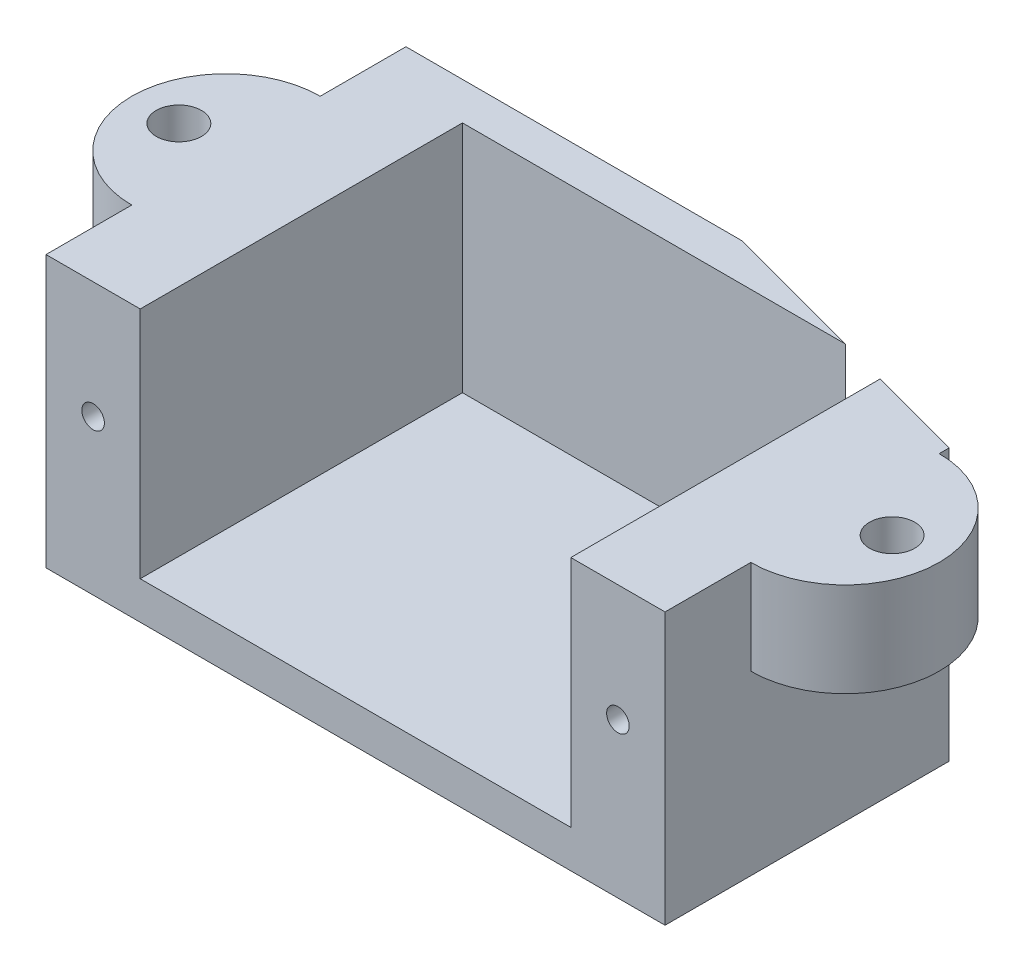
ISO-10303-21;
HEADER;
FILE_DESCRIPTION(('STEP AP214'),'2;1');
FILE_NAME('part.step','',(''),(''),'','','');
FILE_SCHEMA(('AUTOMOTIVE_DESIGN { 1 0 10303 214 1 1 1 1 }'));
ENDSEC;
DATA;
#1=APPLICATION_CONTEXT('core data for automotive mechanical design processes');
#2=APPLICATION_PROTOCOL_DEFINITION('international standard','automotive_design',2000,#1);
#3=PRODUCT_CONTEXT('',#1,'mechanical');
#4=PRODUCT('Part','Part','',(#3));
#5=PRODUCT_RELATED_PRODUCT_CATEGORY('part','',(#4));
#6=PRODUCT_DEFINITION_FORMATION('','',#4);
#7=PRODUCT_DEFINITION_CONTEXT('part definition',#1,'design');
#8=PRODUCT_DEFINITION('design','',#6,#7);
#9=PRODUCT_DEFINITION_SHAPE('','',#8);
#10=(LENGTH_UNIT() NAMED_UNIT(*) SI_UNIT(.MILLI.,.METRE.));
#11=(NAMED_UNIT(*) PLANE_ANGLE_UNIT() SI_UNIT($,.RADIAN.));
#12=(NAMED_UNIT(*) SI_UNIT($,.STERADIAN.) SOLID_ANGLE_UNIT());
#13=UNCERTAINTY_MEASURE_WITH_UNIT(LENGTH_MEASURE(1.E-05),#10,'distance_accuracy_value','');
#14=(GEOMETRIC_REPRESENTATION_CONTEXT(3) GLOBAL_UNCERTAINTY_ASSIGNED_CONTEXT((#13)) GLOBAL_UNIT_ASSIGNED_CONTEXT((#10,
#11,#12)) REPRESENTATION_CONTEXT('',''));
#15=CARTESIAN_POINT('',(0.,0.,0.));
#16=DIRECTION('',(0.,0.,1.));
#17=DIRECTION('',(1.,0.,0.));
#18=AXIS2_PLACEMENT_3D('',#15,#16,#17);
#19=CARTESIAN_POINT('',(16.425,8.2,17.1));
#20=DIRECTION('',(-1.,0.,0.));
#21=DIRECTION('',(0.,0.,1.));
#22=AXIS2_PLACEMENT_3D('',#19,#20,#21);
#23=PLANE('',#22);
#24=DIRECTION('',(0.,1.,0.));
#25=VECTOR('',#24,1.);
#26=CARTESIAN_POINT('',(16.425,1.2,12.55));
#27=LINE('',#26,#25);
#28=CARTESIAN_POINT('',(16.425,1.2,12.55));
#29=VERTEX_POINT('',#28);
#30=CARTESIAN_POINT('',(16.425,6.2,12.55));
#31=VERTEX_POINT('',#30);
#32=EDGE_CURVE('E155',#29,#31,#27,.T.);
#33=ORIENTED_EDGE('',*,*,#32,.T.);
#34=DIRECTION('',(0.,0.,1.));
#35=VECTOR('',#34,1.);
#36=CARTESIAN_POINT('',(16.425,6.2,-2.001));
#37=LINE('',#36,#35);
#38=CARTESIAN_POINT('',(16.425,6.2,17.1));
#39=VERTEX_POINT('',#38);
#40=EDGE_CURVE('E143',#31,#39,#37,.T.);
#41=ORIENTED_EDGE('',*,*,#40,.T.);
#42=DIRECTION('',(0.,1.,0.));
#43=VECTOR('',#42,1.);
#44=CARTESIAN_POINT('',(16.425,8.2,17.1));
#45=LINE('',#44,#43);
#46=CARTESIAN_POINT('',(16.425,-8.2,17.1));
#47=VERTEX_POINT('',#46);
#48=EDGE_CURVE('E260',#47,#39,#45,.T.);
#49=ORIENTED_EDGE('',*,*,#48,.F.);
#50=DIRECTION('',(0.,0.,-1.));
#51=VECTOR('',#50,1.);
#52=CARTESIAN_POINT('',(16.425,-8.2,17.1));
#53=LINE('',#52,#51);
#54=CARTESIAN_POINT('',(16.425,-8.2,2.01923788646674));
#55=VERTEX_POINT('',#54);
#56=EDGE_CURVE('E262',#47,#55,#53,.T.);
#57=ORIENTED_EDGE('',*,*,#56,.T.);
#58=DIRECTION('',(0.,-1.,0.));
#59=VECTOR('',#58,1.);
#60=CARTESIAN_POINT('',(16.425,8.2,2.01923788646674));
#61=LINE('',#60,#59);
#62=CARTESIAN_POINT('',(16.425,6.2,2.01923788646674));
#63=VERTEX_POINT('',#62);
#64=EDGE_CURVE('E201',#63,#55,#61,.T.);
#65=ORIENTED_EDGE('',*,*,#64,.F.);
#66=CARTESIAN_POINT('',(16.425,6.2,2.55));
#67=VERTEX_POINT('',#66);
#68=EDGE_CURVE('E151',#63,#67,#37,.T.);
#69=ORIENTED_EDGE('',*,*,#68,.T.);
#70=DIRECTION('',(0.,1.,0.));
#71=VECTOR('',#70,1.);
#72=CARTESIAN_POINT('',(16.425,1.2,2.55));
#73=LINE('',#72,#71);
#74=CARTESIAN_POINT('',(16.425,1.2,2.55));
#75=VERTEX_POINT('',#74);
#76=EDGE_CURVE('E52',#75,#67,#73,.T.);
#77=ORIENTED_EDGE('',*,*,#76,.F.);
#78=DIRECTION('',(0.,0.,-1.));
#79=VECTOR('',#78,1.);
#80=CARTESIAN_POINT('',(16.425,1.2,2.55));
#81=LINE('',#80,#79);
#82=EDGE_CURVE('E56',#29,#75,#81,.T.);
#83=ORIENTED_EDGE('',*,*,#82,.F.);
#84=EDGE_LOOP('',(#33,#41,#49,#57,#65,#69,#77,#83));
#85=FACE_BOUND('',#84,.T.);
#86=ADVANCED_FACE('F37',(#85),#23,.F.);
#87=CARTESIAN_POINT('',(0.,0.,17.1));
#88=DIRECTION('',(0.,0.,-1.));
#89=DIRECTION('',(-1.,0.,0.));
#90=AXIS2_PLACEMENT_3D('',#87,#88,#89);
#91=PLANE('',#90);
#92=CARTESIAN_POINT('',(13.925,0.,17.1));
#93=DIRECTION('',(0.,0.,1.));
#94=DIRECTION('',(1.,0.,0.));
#95=AXIS2_PLACEMENT_3D('',#92,#93,#94);
#96=CIRCLE('',#95,0.599999999999998);
#97=CARTESIAN_POINT('',(14.525,0.,17.1));
#98=VERTEX_POINT('',#97);
#99=EDGE_CURVE('E212',#98,#98,#96,.T.);
#100=ORIENTED_EDGE('',*,*,#99,.F.);
#101=EDGE_LOOP('',(#100));
#102=FACE_BOUND('',#101,.T.);
#103=CARTESIAN_POINT('',(-13.925,0.,17.1));
#104=DIRECTION('',(0.,0.,1.));
#105=DIRECTION('',(1.,0.,0.));
#106=AXIS2_PLACEMENT_3D('',#103,#104,#105);
#107=CIRCLE('',#106,0.599999999999998);
#108=CARTESIAN_POINT('',(-13.325,0.,17.1));
#109=VERTEX_POINT('',#108);
#110=EDGE_CURVE('E218',#109,#109,#107,.T.);
#111=ORIENTED_EDGE('',*,*,#110,.F.);
#112=EDGE_LOOP('',(#111));
#113=FACE_BOUND('',#112,.T.);
#114=ORIENTED_EDGE('',*,*,#48,.T.);
#115=DIRECTION('',(1.,0.,0.));
#116=VECTOR('',#115,1.);
#117=CARTESIAN_POINT('',(-16.425,6.2,17.1));
#118=LINE('',#117,#116);
#119=CARTESIAN_POINT('',(11.425,6.2,17.1));
#120=VERTEX_POINT('',#119);
#121=EDGE_CURVE('E148',#120,#39,#118,.T.);
#122=ORIENTED_EDGE('',*,*,#121,.F.);
#123=DIRECTION('',(0.,1.,0.));
#124=VECTOR('',#123,1.);
#125=CARTESIAN_POINT('',(11.425,6.2,17.1));
#126=LINE('',#125,#124);
#127=CARTESIAN_POINT('',(11.425,-6.2,17.1));
#128=VERTEX_POINT('',#127);
#129=EDGE_CURVE('E235',#128,#120,#126,.T.);
#130=ORIENTED_EDGE('',*,*,#129,.F.);
#131=DIRECTION('',(1.,0.,0.));
#132=VECTOR('',#131,1.);
#133=CARTESIAN_POINT('',(11.425,-6.2,17.1));
#134=LINE('',#133,#132);
#135=CARTESIAN_POINT('',(-11.425,-6.2,17.1));
#136=VERTEX_POINT('',#135);
#137=EDGE_CURVE('E232',#136,#128,#134,.T.);
#138=ORIENTED_EDGE('',*,*,#137,.F.);
#139=DIRECTION('',(0.,-1.,0.));
#140=VECTOR('',#139,1.);
#141=CARTESIAN_POINT('',(-11.425,6.2,17.1));
#142=LINE('',#141,#140);
#143=CARTESIAN_POINT('',(-11.425,6.2,17.1));
#144=VERTEX_POINT('',#143);
#145=EDGE_CURVE('E230',#144,#136,#142,.T.);
#146=ORIENTED_EDGE('',*,*,#145,.F.);
#147=CARTESIAN_POINT('',(-16.425,6.2,17.1));
#148=VERTEX_POINT('',#147);
#149=EDGE_CURVE('E189',#148,#144,#118,.T.);
#150=ORIENTED_EDGE('',*,*,#149,.F.);
#151=DIRECTION('',(0.,-1.,0.));
#152=VECTOR('',#151,1.);
#153=CARTESIAN_POINT('',(-16.425,8.2,17.1));
#154=LINE('',#153,#152);
#155=CARTESIAN_POINT('',(-16.425,-8.2,17.1));
#156=VERTEX_POINT('',#155);
#157=EDGE_CURVE('E256',#148,#156,#154,.T.);
#158=ORIENTED_EDGE('',*,*,#157,.T.);
#159=DIRECTION('',(1.,0.,0.));
#160=VECTOR('',#159,1.);
#161=CARTESIAN_POINT('',(16.425,-8.2,17.1));
#162=LINE('',#161,#160);
#163=EDGE_CURVE('E258',#156,#47,#162,.T.);
#164=ORIENTED_EDGE('',*,*,#163,.T.);
#165=EDGE_LOOP('',(#114,#122,#130,#138,#146,#150,#158,#164));
#166=FACE_BOUND('',#165,.T.);
#167=ADVANCED_FACE('F285',(#102,#113,#166),#91,.F.);
#168=CARTESIAN_POINT('',(-16.425,8.2,17.1));
#169=DIRECTION('',(1.,0.,0.));
#170=DIRECTION('',(0.,0.,-1.));
#171=AXIS2_PLACEMENT_3D('',#168,#169,#170);
#172=PLANE('',#171);
#173=DIRECTION('',(0.,0.,-1.));
#174=VECTOR('',#173,1.);
#175=CARTESIAN_POINT('',(-16.425,1.2,2.55));
#176=LINE('',#175,#174);
#177=CARTESIAN_POINT('',(-16.425,1.2,12.55));
#178=VERTEX_POINT('',#177);
#179=CARTESIAN_POINT('',(-16.425,1.2,2.55));
#180=VERTEX_POINT('',#179);
#181=EDGE_CURVE('E179',#178,#180,#176,.T.);
#182=ORIENTED_EDGE('',*,*,#181,.T.);
#183=DIRECTION('',(0.,1.,0.));
#184=VECTOR('',#183,1.);
#185=CARTESIAN_POINT('',(-16.425,1.2,2.55));
#186=LINE('',#185,#184);
#187=CARTESIAN_POINT('',(-16.425,6.2,2.55));
#188=VERTEX_POINT('',#187);
#189=EDGE_CURVE('E184',#180,#188,#186,.T.);
#190=ORIENTED_EDGE('',*,*,#189,.T.);
#191=DIRECTION('',(0.,0.,1.));
#192=VECTOR('',#191,1.);
#193=CARTESIAN_POINT('',(-16.425,6.2,-2.001));
#194=LINE('',#193,#192);
#195=CARTESIAN_POINT('',(-16.425,6.2,-2.));
#196=VERTEX_POINT('',#195);
#197=EDGE_CURVE('E152',#196,#188,#194,.T.);
#198=ORIENTED_EDGE('',*,*,#197,.F.);
#199=DIRECTION('',(0.,1.,0.));
#200=VECTOR('',#199,1.);
#201=CARTESIAN_POINT('',(-16.425,8.2,-2.));
#202=LINE('',#201,#200);
#203=CARTESIAN_POINT('',(-16.425,-8.2,-2.));
#204=VERTEX_POINT('',#203);
#205=EDGE_CURVE('E226',#204,#196,#202,.T.);
#206=ORIENTED_EDGE('',*,*,#205,.F.);
#207=DIRECTION('',(0.,0.,-1.));
#208=VECTOR('',#207,1.);
#209=CARTESIAN_POINT('',(-16.425,-8.2,17.1));
#210=LINE('',#209,#208);
#211=EDGE_CURVE('E45',#156,#204,#210,.T.);
#212=ORIENTED_EDGE('',*,*,#211,.F.);
#213=ORIENTED_EDGE('',*,*,#157,.F.);
#214=CARTESIAN_POINT('',(-16.425,6.2,12.55));
#215=VERTEX_POINT('',#214);
#216=EDGE_CURVE('E190',#215,#148,#194,.T.);
#217=ORIENTED_EDGE('',*,*,#216,.F.);
#218=DIRECTION('',(0.,1.,0.));
#219=VECTOR('',#218,1.);
#220=CARTESIAN_POINT('',(-16.425,1.2,12.55));
#221=LINE('',#220,#219);
#222=EDGE_CURVE('E182',#178,#215,#221,.T.);
#223=ORIENTED_EDGE('',*,*,#222,.F.);
#224=EDGE_LOOP('',(#182,#190,#198,#206,#212,#213,#217,#223));
#225=FACE_BOUND('',#224,.T.);
#226=ADVANCED_FACE('F39',(#225),#172,.F.);
#227=CARTESIAN_POINT('',(16.425,-8.2,17.1));
#228=DIRECTION('',(0.,1.,0.));
#229=DIRECTION('',(0.,0.,1.));
#230=AXIS2_PLACEMENT_3D('',#227,#228,#229);
#231=PLANE('',#230);
#232=DIRECTION('',(-1.,0.,0.));
#233=VECTOR('',#232,1.);
#234=CARTESIAN_POINT('',(-16.425,-8.2,-2.));
#235=LINE('',#234,#233);
#236=CARTESIAN_POINT('',(1.425,-8.2,-2.));
#237=VERTEX_POINT('',#236);
#238=EDGE_CURVE('E224',#237,#204,#235,.T.);
#239=ORIENTED_EDGE('',*,*,#238,.F.);
#240=DIRECTION('',(-0.96592582628907,0.,-0.258819045102515));
#241=VECTOR('',#240,1.);
#242=CARTESIAN_POINT('',(1.425,-8.2,-2.));
#243=LINE('',#242,#241);
#244=EDGE_CURVE('E198',#55,#237,#243,.T.);
#245=ORIENTED_EDGE('',*,*,#244,.F.);
#246=ORIENTED_EDGE('',*,*,#56,.F.);
#247=ORIENTED_EDGE('',*,*,#163,.F.);
#248=ORIENTED_EDGE('',*,*,#211,.T.);
#249=EDGE_LOOP('',(#239,#245,#246,#247,#248));
#250=FACE_BOUND('',#249,.T.);
#251=ADVANCED_FACE('F270',(#250),#231,.F.);
#252=CARTESIAN_POINT('',(-11.425,6.2,17.1));
#253=DIRECTION('',(1.,0.,0.));
#254=DIRECTION('',(0.,0.,-1.));
#255=AXIS2_PLACEMENT_3D('',#252,#253,#254);
#256=PLANE('',#255);
#257=DIRECTION('',(0.,-1.,0.));
#258=VECTOR('',#257,1.);
#259=CARTESIAN_POINT('',(-11.425,6.2,0.));
#260=LINE('',#259,#258);
#261=CARTESIAN_POINT('',(-11.425,6.2,0.));
#262=VERTEX_POINT('',#261);
#263=CARTESIAN_POINT('',(-11.425,-6.2,0.));
#264=VERTEX_POINT('',#263);
#265=EDGE_CURVE('E229',#262,#264,#260,.T.);
#266=ORIENTED_EDGE('',*,*,#265,.F.);
#267=DIRECTION('',(0.,0.,-1.));
#268=VECTOR('',#267,1.);
#269=CARTESIAN_POINT('',(-11.425,6.2,17.1));
#270=LINE('',#269,#268);
#271=EDGE_CURVE('E238',#144,#262,#270,.T.);
#272=ORIENTED_EDGE('',*,*,#271,.F.);
#273=ORIENTED_EDGE('',*,*,#145,.T.);
#274=DIRECTION('',(0.,0.,-1.));
#275=VECTOR('',#274,1.);
#276=CARTESIAN_POINT('',(-11.425,-6.2,17.1));
#277=LINE('',#276,#275);
#278=EDGE_CURVE('E253',#136,#264,#277,.T.);
#279=ORIENTED_EDGE('',*,*,#278,.T.);
#280=EDGE_LOOP('',(#266,#272,#273,#279));
#281=FACE_BOUND('',#280,.T.);
#282=ADVANCED_FACE('F321',(#281),#256,.T.);
#283=CARTESIAN_POINT('',(11.425,-6.2,17.1));
#284=DIRECTION('',(0.,1.,0.));
#285=DIRECTION('',(-1.,0.,0.));
#286=AXIS2_PLACEMENT_3D('',#283,#284,#285);
#287=PLANE('',#286);
#288=DIRECTION('',(0.96592582628907,0.,0.258819045102515));
#289=VECTOR('',#288,1.);
#290=CARTESIAN_POINT('',(15.5301270189221,-6.2,1.7794573938585));
#291=LINE('',#290,#289);
#292=CARTESIAN_POINT('',(8.88910161513795,-6.2,0.));
#293=VERTEX_POINT('',#292);
#294=CARTESIAN_POINT('',(11.425,-6.2,0.679491924311157));
#295=VERTEX_POINT('',#294);
#296=EDGE_CURVE('E210',#293,#295,#291,.T.);
#297=ORIENTED_EDGE('',*,*,#296,.F.);
#298=DIRECTION('',(1.,0.,0.));
#299=VECTOR('',#298,1.);
#300=CARTESIAN_POINT('',(11.425,-6.2,0.));
#301=LINE('',#300,#299);
#302=EDGE_CURVE('E241',#264,#293,#301,.T.);
#303=ORIENTED_EDGE('',*,*,#302,.F.);
#304=ORIENTED_EDGE('',*,*,#278,.F.);
#305=ORIENTED_EDGE('',*,*,#137,.T.);
#306=DIRECTION('',(0.,0.,-1.));
#307=VECTOR('',#306,1.);
#308=CARTESIAN_POINT('',(11.425,-6.2,17.1));
#309=LINE('',#308,#307);
#310=EDGE_CURVE('E250',#128,#295,#309,.T.);
#311=ORIENTED_EDGE('',*,*,#310,.T.);
#312=EDGE_LOOP('',(#297,#303,#304,#305,#311));
#313=FACE_BOUND('',#312,.T.);
#314=ADVANCED_FACE('F326',(#313),#287,.T.);
#315=CARTESIAN_POINT('',(11.425,6.2,17.1));
#316=DIRECTION('',(-1.,0.,0.));
#317=DIRECTION('',(0.,-1.,0.));
#318=AXIS2_PLACEMENT_3D('',#315,#316,#317);
#319=PLANE('',#318);
#320=DIRECTION('',(0.,1.,0.));
#321=VECTOR('',#320,1.);
#322=CARTESIAN_POINT('',(11.425,6.2,0.679491924311156));
#323=LINE('',#322,#321);
#324=CARTESIAN_POINT('',(11.425,6.2,0.679491924311159));
#325=VERTEX_POINT('',#324);
#326=EDGE_CURVE('E207',#295,#325,#323,.T.);
#327=ORIENTED_EDGE('',*,*,#326,.F.);
#328=ORIENTED_EDGE('',*,*,#310,.F.);
#329=ORIENTED_EDGE('',*,*,#129,.T.);
#330=DIRECTION('',(0.,0.,-1.));
#331=VECTOR('',#330,1.);
#332=CARTESIAN_POINT('',(11.425,6.2,17.1));
#333=LINE('',#332,#331);
#334=EDGE_CURVE('E247',#120,#325,#333,.T.);
#335=ORIENTED_EDGE('',*,*,#334,.T.);
#336=EDGE_LOOP('',(#327,#328,#329,#335));
#337=FACE_BOUND('',#336,.T.);
#338=ADVANCED_FACE('F355',(#337),#319,.T.);
#339=CARTESIAN_POINT('',(0.,0.,0.));
#340=DIRECTION('',(0.,0.,1.));
#341=DIRECTION('',(1.,0.,0.));
#342=AXIS2_PLACEMENT_3D('',#339,#340,#341);
#343=PLANE('',#342);
#344=DIRECTION('',(0.,-1.,0.));
#345=VECTOR('',#344,1.);
#346=CARTESIAN_POINT('',(8.88910161513795,0.,0.));
#347=LINE('',#346,#345);
#348=CARTESIAN_POINT('',(8.88910161513795,6.2,0.));
#349=VERTEX_POINT('',#348);
#350=EDGE_CURVE('E204',#349,#293,#347,.T.);
#351=ORIENTED_EDGE('',*,*,#350,.F.);
#352=DIRECTION('',(-1.,0.,0.));
#353=VECTOR('',#352,1.);
#354=CARTESIAN_POINT('',(11.425,6.2,0.));
#355=LINE('',#354,#353);
#356=EDGE_CURVE('E233',#349,#262,#355,.T.);
#357=ORIENTED_EDGE('',*,*,#356,.T.);
#358=ORIENTED_EDGE('',*,*,#265,.T.);
#359=ORIENTED_EDGE('',*,*,#302,.T.);
#360=EDGE_LOOP('',(#351,#357,#358,#359));
#361=FACE_BOUND('',#360,.T.);
#362=ADVANCED_FACE('F360',(#361),#343,.T.);
#363=CARTESIAN_POINT('',(0.,0.,-2.));
#364=DIRECTION('',(0.,0.,1.));
#365=DIRECTION('',(1.,0.,0.));
#366=AXIS2_PLACEMENT_3D('',#363,#364,#365);
#367=PLANE('',#366);
#368=ORIENTED_EDGE('',*,*,#205,.T.);
#369=DIRECTION('',(-1.,0.,0.));
#370=VECTOR('',#369,1.);
#371=CARTESIAN_POINT('',(-16.425,6.2,-2.));
#372=LINE('',#371,#370);
#373=CARTESIAN_POINT('',(1.425,6.2,-2.));
#374=VERTEX_POINT('',#373);
#375=EDGE_CURVE('E196',#374,#196,#372,.T.);
#376=ORIENTED_EDGE('',*,*,#375,.F.);
#377=DIRECTION('',(0.,-1.,0.));
#378=VECTOR('',#377,1.);
#379=CARTESIAN_POINT('',(1.425,8.2,-2.));
#380=LINE('',#379,#378);
#381=EDGE_CURVE('E202',#374,#237,#380,.T.);
#382=ORIENTED_EDGE('',*,*,#381,.T.);
#383=ORIENTED_EDGE('',*,*,#238,.T.);
#384=EDGE_LOOP('',(#368,#376,#382,#383));
#385=FACE_BOUND('',#384,.T.);
#386=ADVANCED_FACE('F278',(#385),#367,.F.);
#387=CARTESIAN_POINT('',(-13.925,0.,7.1));
#388=DIRECTION('',(0.,0.,1.));
#389=DIRECTION('',(1.,0.,0.));
#390=AXIS2_PLACEMENT_3D('',#387,#388,#389);
#391=CONICAL_SURFACE('',#390,0.599999999999996,1.02974425867665);
#392=CARTESIAN_POINT('',(-13.925,0.,6.73948362858346));
#393=VERTEX_POINT('',#392);
#394=VERTEX_LOOP('',#393);
#395=FACE_BOUND('',#394,.T.);
#396=CARTESIAN_POINT('',(-13.925,0.,7.1));
#397=DIRECTION('',(0.,0.,1.));
#398=DIRECTION('',(1.,0.,0.));
#399=AXIS2_PLACEMENT_3D('',#396,#397,#398);
#400=CIRCLE('',#399,0.599999999999996);
#401=CARTESIAN_POINT('',(-13.325,0.,7.1));
#402=VERTEX_POINT('',#401);
#403=EDGE_CURVE('E221',#402,#402,#400,.T.);
#404=ORIENTED_EDGE('',*,*,#403,.T.);
#405=EDGE_LOOP('',(#404));
#406=FACE_BOUND('',#405,.T.);
#407=ADVANCED_FACE('F381',(#395,#406),#391,.F.);
#408=CARTESIAN_POINT('',(-13.925,0.,17.1));
#409=DIRECTION('',(0.,0.,1.));
#410=DIRECTION('',(1.,0.,0.));
#411=AXIS2_PLACEMENT_3D('',#408,#409,#410);
#412=CYLINDRICAL_SURFACE('',#411,0.599999999999997);
#413=ORIENTED_EDGE('',*,*,#403,.F.);
#414=EDGE_LOOP('',(#413));
#415=FACE_BOUND('',#414,.T.);
#416=ORIENTED_EDGE('',*,*,#110,.T.);
#417=EDGE_LOOP('',(#416));
#418=FACE_BOUND('',#417,.T.);
#419=ADVANCED_FACE('F511',(#415,#418),#412,.F.);
#420=CARTESIAN_POINT('',(13.925,0.,7.1));
#421=DIRECTION('',(0.,0.,1.));
#422=DIRECTION('',(1.,0.,0.));
#423=AXIS2_PLACEMENT_3D('',#420,#421,#422);
#424=CONICAL_SURFACE('',#423,0.599999999999996,1.02974425867665);
#425=CARTESIAN_POINT('',(13.925,0.,6.73948362858346));
#426=VERTEX_POINT('',#425);
#427=VERTEX_LOOP('',#426);
#428=FACE_BOUND('',#427,.T.);
#429=CARTESIAN_POINT('',(13.925,0.,7.1));
#430=DIRECTION('',(0.,0.,1.));
#431=DIRECTION('',(1.,0.,0.));
#432=AXIS2_PLACEMENT_3D('',#429,#430,#431);
#433=CIRCLE('',#432,0.599999999999996);
#434=CARTESIAN_POINT('',(14.525,0.,7.1));
#435=VERTEX_POINT('',#434);
#436=EDGE_CURVE('E215',#435,#435,#433,.T.);
#437=ORIENTED_EDGE('',*,*,#436,.T.);
#438=EDGE_LOOP('',(#437));
#439=FACE_BOUND('',#438,.T.);
#440=ADVANCED_FACE('F503',(#428,#439),#424,.F.);
#441=CARTESIAN_POINT('',(13.925,0.,17.1));
#442=DIRECTION('',(0.,0.,1.));
#443=DIRECTION('',(1.,0.,0.));
#444=AXIS2_PLACEMENT_3D('',#441,#442,#443);
#445=CYLINDRICAL_SURFACE('',#444,0.599999999999997);
#446=ORIENTED_EDGE('',*,*,#436,.F.);
#447=EDGE_LOOP('',(#446));
#448=FACE_BOUND('',#447,.T.);
#449=ORIENTED_EDGE('',*,*,#99,.T.);
#450=EDGE_LOOP('',(#449));
#451=FACE_BOUND('',#450,.T.);
#452=ADVANCED_FACE('F392',(#448,#451),#445,.F.);
#453=CARTESIAN_POINT('',(1.425,8.2,-2.));
#454=DIRECTION('',(-0.258819045102515,0.,0.96592582628907));
#455=DIRECTION('',(0.96592582628907,0.,0.258819045102515));
#456=AXIS2_PLACEMENT_3D('',#453,#454,#455);
#457=PLANE('',#456);
#458=ORIENTED_EDGE('',*,*,#381,.F.);
#459=DIRECTION('',(0.96592582628907,0.,0.258819045102515));
#460=VECTOR('',#459,1.);
#461=CARTESIAN_POINT('',(1.425,6.2,-2.));
#462=LINE('',#461,#460);
#463=EDGE_CURVE('E11',#374,#349,#462,.T.);
#464=ORIENTED_EDGE('',*,*,#463,.T.);
#465=ORIENTED_EDGE('',*,*,#350,.T.);
#466=ORIENTED_EDGE('',*,*,#296,.T.);
#467=ORIENTED_EDGE('',*,*,#326,.T.);
#468=DIRECTION('',(-0.96592582628907,0.,-0.258819045102515));
#469=VECTOR('',#468,1.);
#470=CARTESIAN_POINT('',(-15.2295267287762,6.2,-6.46256698729801));
#471=LINE('',#470,#469);
#472=EDGE_CURVE('E192',#63,#325,#471,.T.);
#473=ORIENTED_EDGE('',*,*,#472,.F.);
#474=ORIENTED_EDGE('',*,*,#64,.T.);
#475=ORIENTED_EDGE('',*,*,#244,.T.);
#476=EDGE_LOOP('',(#458,#464,#465,#466,#467,#473,#474,#475));
#477=FACE_BOUND('',#476,.T.);
#478=ADVANCED_FACE('F281',(#477),#457,.F.);
#479=CARTESIAN_POINT('',(-16.425,6.2,-2.001));
#480=DIRECTION('',(0.,-1.,0.));
#481=DIRECTION('',(0.,0.,-1.));
#482=AXIS2_PLACEMENT_3D('',#479,#480,#481);
#483=PLANE('',#482);
#484=CARTESIAN_POINT('',(18.925,6.2,7.55));
#485=DIRECTION('',(0.,-1.,0.));
#486=DIRECTION('',(0.,0.,-1.));
#487=AXIS2_PLACEMENT_3D('',#484,#485,#486);
#488=CIRCLE('',#487,1.2);
#489=CARTESIAN_POINT('',(18.925,6.2,6.35));
#490=VERTEX_POINT('',#489);
#491=EDGE_CURVE('E162',#490,#490,#488,.T.);
#492=ORIENTED_EDGE('',*,*,#491,.T.);
#493=EDGE_LOOP('',(#492));
#494=FACE_BOUND('',#493,.T.);
#495=ORIENTED_EDGE('',*,*,#334,.F.);
#496=ORIENTED_EDGE('',*,*,#121,.T.);
#497=ORIENTED_EDGE('',*,*,#40,.F.);
#498=CARTESIAN_POINT('',(16.425,6.2,7.55));
#499=DIRECTION('',(0.,-1.,0.));
#500=DIRECTION('',(0.,0.,1.));
#501=AXIS2_PLACEMENT_3D('',#498,#499,#500);
#502=CIRCLE('',#501,5.);
#503=EDGE_CURVE('E146',#67,#31,#502,.T.);
#504=ORIENTED_EDGE('',*,*,#503,.F.);
#505=ORIENTED_EDGE('',*,*,#68,.F.);
#506=ORIENTED_EDGE('',*,*,#472,.T.);
#507=EDGE_LOOP('',(#495,#496,#497,#504,#505,#506));
#508=FACE_BOUND('',#507,.T.);
#509=ADVANCED_FACE('F144',(#494,#508),#483,.F.);
#510=CARTESIAN_POINT('',(-18.925,6.2,7.55));
#511=DIRECTION('',(0.,-1.,0.));
#512=DIRECTION('',(0.,0.,-1.));
#513=AXIS2_PLACEMENT_3D('',#510,#511,#512);
#514=CIRCLE('',#513,1.2);
#515=CARTESIAN_POINT('',(-18.925,6.2,6.35));
#516=VERTEX_POINT('',#515);
#517=EDGE_CURVE('E173',#516,#516,#514,.T.);
#518=ORIENTED_EDGE('',*,*,#517,.T.);
#519=EDGE_LOOP('',(#518));
#520=FACE_BOUND('',#519,.T.);
#521=ORIENTED_EDGE('',*,*,#271,.T.);
#522=ORIENTED_EDGE('',*,*,#356,.F.);
#523=ORIENTED_EDGE('',*,*,#463,.F.);
#524=ORIENTED_EDGE('',*,*,#375,.T.);
#525=ORIENTED_EDGE('',*,*,#197,.T.);
#526=CARTESIAN_POINT('',(-16.425,6.2,7.55));
#527=DIRECTION('',(0.,1.,0.));
#528=DIRECTION('',(0.,0.,1.));
#529=AXIS2_PLACEMENT_3D('',#526,#527,#528);
#530=CIRCLE('',#529,5.);
#531=EDGE_CURVE('E176',#188,#215,#530,.T.);
#532=ORIENTED_EDGE('',*,*,#531,.T.);
#533=ORIENTED_EDGE('',*,*,#216,.T.);
#534=ORIENTED_EDGE('',*,*,#149,.T.);
#535=EDGE_LOOP('',(#521,#522,#523,#524,#525,#532,#533,#534));
#536=FACE_BOUND('',#535,.T.);
#537=ADVANCED_FACE('F292',(#520,#536),#483,.F.);
#538=CARTESIAN_POINT('',(-16.425,1.2,7.55));
#539=DIRECTION('',(0.,1.,0.));
#540=DIRECTION('',(0.,0.,1.));
#541=AXIS2_PLACEMENT_3D('',#538,#539,#540);
#542=CYLINDRICAL_SURFACE('',#541,5.);
#543=ORIENTED_EDGE('',*,*,#531,.F.);
#544=ORIENTED_EDGE('',*,*,#189,.F.);
#545=CARTESIAN_POINT('',(-16.425,1.2,7.55));
#546=DIRECTION('',(0.,1.,0.));
#547=DIRECTION('',(0.,0.,1.));
#548=AXIS2_PLACEMENT_3D('',#545,#546,#547);
#549=CIRCLE('',#548,5.);
#550=EDGE_CURVE('E177',#180,#178,#549,.T.);
#551=ORIENTED_EDGE('',*,*,#550,.T.);
#552=ORIENTED_EDGE('',*,*,#222,.T.);
#553=EDGE_LOOP('',(#543,#544,#551,#552));
#554=FACE_BOUND('',#553,.T.);
#555=ADVANCED_FACE('F295',(#554),#542,.T.);
#556=CARTESIAN_POINT('',(-16.425,1.2,7.55));
#557=DIRECTION('',(0.,1.,0.));
#558=DIRECTION('',(0.,0.,1.));
#559=AXIS2_PLACEMENT_3D('',#556,#557,#558);
#560=PLANE('',#559);
#561=CARTESIAN_POINT('',(-18.925,1.2,7.55));
#562=DIRECTION('',(0.,-1.,0.));
#563=DIRECTION('',(0.,0.,-1.));
#564=AXIS2_PLACEMENT_3D('',#561,#562,#563);
#565=CIRCLE('',#564,1.2);
#566=CARTESIAN_POINT('',(-18.925,1.2,6.35));
#567=VERTEX_POINT('',#566);
#568=EDGE_CURVE('E158',#567,#567,#565,.T.);
#569=ORIENTED_EDGE('',*,*,#568,.F.);
#570=EDGE_LOOP('',(#569));
#571=FACE_BOUND('',#570,.T.);
#572=ORIENTED_EDGE('',*,*,#550,.F.);
#573=ORIENTED_EDGE('',*,*,#181,.F.);
#574=EDGE_LOOP('',(#572,#573));
#575=FACE_BOUND('',#574,.T.);
#576=ADVANCED_FACE('F299',(#571,#575),#560,.F.);
#577=CARTESIAN_POINT('',(-18.925,1.2,7.55));
#578=DIRECTION('',(0.,-1.,0.));
#579=DIRECTION('',(0.,0.,-1.));
#580=AXIS2_PLACEMENT_3D('',#577,#578,#579);
#581=CYLINDRICAL_SURFACE('',#580,1.2);
#582=ORIENTED_EDGE('',*,*,#568,.T.);
#583=EDGE_LOOP('',(#582));
#584=FACE_BOUND('',#583,.T.);
#585=ORIENTED_EDGE('',*,*,#517,.F.);
#586=EDGE_LOOP('',(#585));
#587=FACE_BOUND('',#586,.T.);
#588=ADVANCED_FACE('F301',(#584,#587),#581,.F.);
#589=CARTESIAN_POINT('',(16.425,1.2,7.55));
#590=DIRECTION('',(0.,1.,0.));
#591=DIRECTION('',(0.,0.,1.));
#592=AXIS2_PLACEMENT_3D('',#589,#590,#591);
#593=CYLINDRICAL_SURFACE('',#592,5.);
#594=ORIENTED_EDGE('',*,*,#503,.T.);
#595=ORIENTED_EDGE('',*,*,#32,.F.);
#596=CARTESIAN_POINT('',(16.425,1.2,7.55));
#597=DIRECTION('',(0.,-1.,0.));
#598=DIRECTION('',(0.,0.,1.));
#599=AXIS2_PLACEMENT_3D('',#596,#597,#598);
#600=CIRCLE('',#599,5.);
#601=EDGE_CURVE('E161',#75,#29,#600,.T.);
#602=ORIENTED_EDGE('',*,*,#601,.F.);
#603=ORIENTED_EDGE('',*,*,#76,.T.);
#604=EDGE_LOOP('',(#594,#595,#602,#603));
#605=FACE_BOUND('',#604,.T.);
#606=ADVANCED_FACE('F160',(#605),#593,.T.);
#607=CARTESIAN_POINT('',(16.425,1.2,7.55));
#608=DIRECTION('',(0.,1.,0.));
#609=DIRECTION('',(0.,0.,1.));
#610=AXIS2_PLACEMENT_3D('',#607,#608,#609);
#611=PLANE('',#610);
#612=CARTESIAN_POINT('',(18.925,1.2,7.55));
#613=DIRECTION('',(0.,-1.,0.));
#614=DIRECTION('',(0.,0.,-1.));
#615=AXIS2_PLACEMENT_3D('',#612,#613,#614);
#616=CIRCLE('',#615,1.2);
#617=CARTESIAN_POINT('',(18.925,1.2,6.35));
#618=VERTEX_POINT('',#617);
#619=EDGE_CURVE('E166',#618,#618,#616,.T.);
#620=ORIENTED_EDGE('',*,*,#619,.F.);
#621=EDGE_LOOP('',(#620));
#622=FACE_BOUND('',#621,.T.);
#623=ORIENTED_EDGE('',*,*,#601,.T.);
#624=ORIENTED_EDGE('',*,*,#82,.T.);
#625=EDGE_LOOP('',(#623,#624));
#626=FACE_BOUND('',#625,.T.);
#627=ADVANCED_FACE('F461',(#622,#626),#611,.F.);
#628=CARTESIAN_POINT('',(18.925,1.2,7.55));
#629=DIRECTION('',(0.,-1.,0.));
#630=DIRECTION('',(0.,0.,-1.));
#631=AXIS2_PLACEMENT_3D('',#628,#629,#630);
#632=CYLINDRICAL_SURFACE('',#631,1.2);
#633=ORIENTED_EDGE('',*,*,#619,.T.);
#634=EDGE_LOOP('',(#633));
#635=FACE_BOUND('',#634,.T.);
#636=ORIENTED_EDGE('',*,*,#491,.F.);
#637=EDGE_LOOP('',(#636));
#638=FACE_BOUND('',#637,.T.);
#639=ADVANCED_FACE('F471',(#635,#638),#632,.F.);
#640=CLOSED_SHELL('',(#86,#167,#226,#251,#282,#314,#338,#362,#386,#407,#419,#440,#452,#478,#509,
#537,#555,#576,#588,#606,#627,#639));
#641=MANIFOLD_SOLID_BREP('B2',#640);
#642=ADVANCED_BREP_SHAPE_REPRESENTATION('',(#18,#641),#14);
#643=SHAPE_DEFINITION_REPRESENTATION(#9,#642);
ENDSEC;
END-ISO-10303-21;
